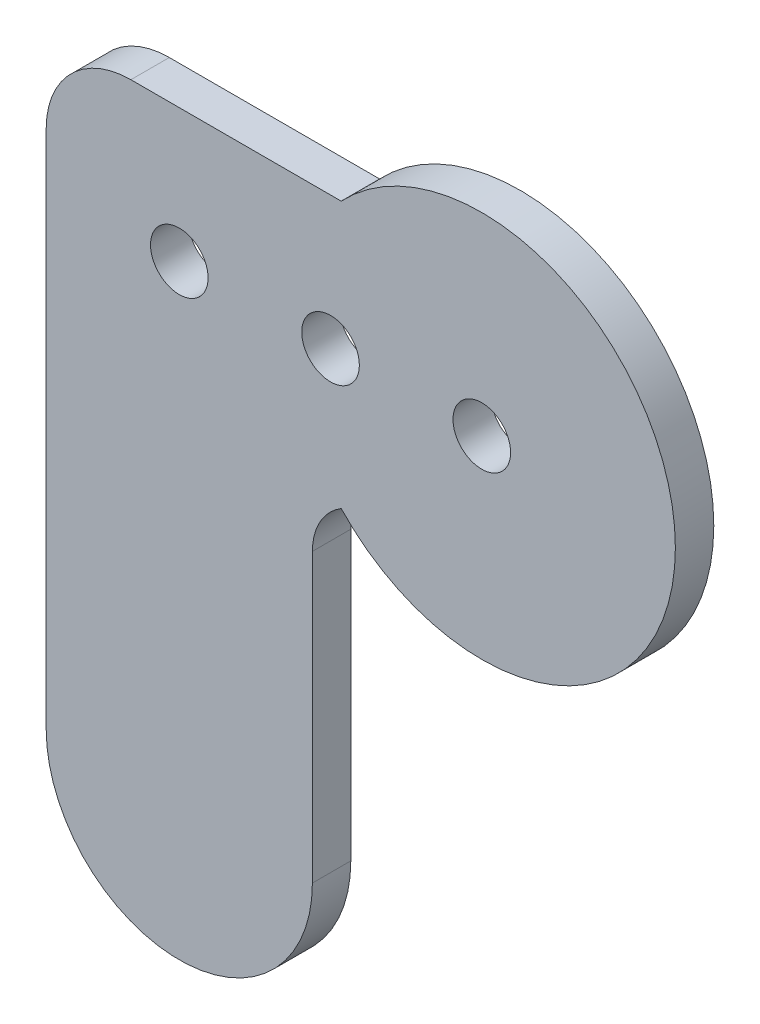
ISO-10303-21;
HEADER;
FILE_DESCRIPTION(('STEP AP214'),'2;1');
FILE_NAME('part.step','',(''),(''),'','','');
FILE_SCHEMA(('AUTOMOTIVE_DESIGN { 1 0 10303 214 1 1 1 1 }'));
ENDSEC;
DATA;
#1=APPLICATION_CONTEXT('core data for automotive mechanical design processes');
#2=APPLICATION_PROTOCOL_DEFINITION('international standard','automotive_design',2000,#1);
#3=PRODUCT_CONTEXT('',#1,'mechanical');
#4=PRODUCT('Part','Part','',(#3));
#5=PRODUCT_RELATED_PRODUCT_CATEGORY('part','',(#4));
#6=PRODUCT_DEFINITION_FORMATION('','',#4);
#7=PRODUCT_DEFINITION_CONTEXT('part definition',#1,'design');
#8=PRODUCT_DEFINITION('design','',#6,#7);
#9=PRODUCT_DEFINITION_SHAPE('','',#8);
#10=(LENGTH_UNIT() NAMED_UNIT(*) SI_UNIT(.MILLI.,.METRE.));
#11=(NAMED_UNIT(*) PLANE_ANGLE_UNIT() SI_UNIT($,.RADIAN.));
#12=(NAMED_UNIT(*) SI_UNIT($,.STERADIAN.) SOLID_ANGLE_UNIT());
#13=UNCERTAINTY_MEASURE_WITH_UNIT(LENGTH_MEASURE(1.E-05),#10,'distance_accuracy_value','');
#14=(GEOMETRIC_REPRESENTATION_CONTEXT(3) GLOBAL_UNCERTAINTY_ASSIGNED_CONTEXT((#13)) GLOBAL_UNIT_ASSIGNED_CONTEXT((#10,
#11,#12)) REPRESENTATION_CONTEXT('',''));
#15=CARTESIAN_POINT('',(0.,0.,0.));
#16=DIRECTION('',(0.,0.,1.));
#17=DIRECTION('',(1.,0.,0.));
#18=AXIS2_PLACEMENT_3D('',#15,#16,#17);
#19=CARTESIAN_POINT('',(0.,0.,3.175));
#20=DIRECTION('',(0.,0.,-1.));
#21=DIRECTION('',(-1.,0.,0.));
#22=AXIS2_PLACEMENT_3D('',#19,#20,#21);
#23=CYLINDRICAL_SURFACE('',#22,16.);
#24=CARTESIAN_POINT('',(0.,0.,0.));
#25=DIRECTION('',(0.,0.,1.));
#26=DIRECTION('',(1.,0.,0.));
#27=AXIS2_PLACEMENT_3D('',#24,#25,#26);
#28=CIRCLE('',#27,16.);
#29=CARTESIAN_POINT('',(-11.6189500386223,-11.,0.));
#30=VERTEX_POINT('',#29);
#31=CARTESIAN_POINT('',(-11.6189500386223,11.,0.));
#32=VERTEX_POINT('',#31);
#33=EDGE_CURVE('E115',#30,#32,#28,.T.);
#34=ORIENTED_EDGE('',*,*,#33,.T.);
#35=DIRECTION('',(0.,0.,-1.));
#36=VECTOR('',#35,1.);
#37=CARTESIAN_POINT('',(-11.6189500386223,11.,3.175));
#38=LINE('',#37,#36);
#39=CARTESIAN_POINT('',(-11.6189500386223,11.,3.175));
#40=VERTEX_POINT('',#39);
#41=EDGE_CURVE('E98',#40,#32,#38,.T.);
#42=ORIENTED_EDGE('',*,*,#41,.F.);
#43=CARTESIAN_POINT('',(0.,0.,3.175));
#44=DIRECTION('',(0.,0.,1.));
#45=DIRECTION('',(1.,0.,0.));
#46=AXIS2_PLACEMENT_3D('',#43,#44,#45);
#47=CIRCLE('',#46,16.);
#48=CARTESIAN_POINT('',(-11.6189500386223,-11.,3.175));
#49=VERTEX_POINT('',#48);
#50=EDGE_CURVE('E105',#49,#40,#47,.T.);
#51=ORIENTED_EDGE('',*,*,#50,.F.);
#52=DIRECTION('',(0.,0.,-1.));
#53=VECTOR('',#52,1.);
#54=CARTESIAN_POINT('',(-11.6189500386223,-11.,3.175));
#55=LINE('',#54,#53);
#56=EDGE_CURVE('E155',#49,#30,#55,.T.);
#57=ORIENTED_EDGE('',*,*,#56,.T.);
#58=EDGE_LOOP('',(#34,#42,#51,#57));
#59=FACE_BOUND('',#58,.T.);
#60=ADVANCED_FACE('F34',(#59),#23,.T.);
#61=CARTESIAN_POINT('',(-11.6189500386223,11.,3.175));
#62=DIRECTION('',(0.,-1.,0.));
#63=DIRECTION('',(1.,0.,0.));
#64=AXIS2_PLACEMENT_3D('',#61,#62,#63);
#65=PLANE('',#64);
#66=DIRECTION('',(-1.,0.,0.));
#67=VECTOR('',#66,1.);
#68=CARTESIAN_POINT('',(-11.6189500386223,11.,0.));
#69=LINE('',#68,#67);
#70=CARTESIAN_POINT('',(-29.,11.,0.));
#71=VERTEX_POINT('',#70);
#72=EDGE_CURVE('E143',#32,#71,#69,.T.);
#73=ORIENTED_EDGE('',*,*,#72,.T.);
#74=DIRECTION('',(0.,0.,-1.));
#75=VECTOR('',#74,1.);
#76=CARTESIAN_POINT('',(-29.,11.,3.175));
#77=LINE('',#76,#75);
#78=CARTESIAN_POINT('',(-29.,11.,3.175));
#79=VERTEX_POINT('',#78);
#80=EDGE_CURVE('E101',#71,#79,#77,.F.);
#81=ORIENTED_EDGE('',*,*,#80,.T.);
#82=DIRECTION('',(-1.,0.,0.));
#83=VECTOR('',#82,1.);
#84=CARTESIAN_POINT('',(-11.6189500386223,11.,3.175));
#85=LINE('',#84,#83);
#86=EDGE_CURVE('E93',#40,#79,#85,.T.);
#87=ORIENTED_EDGE('',*,*,#86,.F.);
#88=ORIENTED_EDGE('',*,*,#41,.T.);
#89=EDGE_LOOP('',(#73,#81,#87,#88));
#90=FACE_BOUND('',#89,.T.);
#91=ADVANCED_FACE('F96',(#90),#65,.F.);
#92=CARTESIAN_POINT('',(-36.,11.,3.175));
#93=DIRECTION('',(1.,0.,0.));
#94=DIRECTION('',(0.,1.,0.));
#95=AXIS2_PLACEMENT_3D('',#92,#93,#94);
#96=PLANE('',#95);
#97=DIRECTION('',(0.,-1.,0.));
#98=VECTOR('',#97,1.);
#99=CARTESIAN_POINT('',(-36.,11.,3.175));
#100=LINE('',#99,#98);
#101=CARTESIAN_POINT('',(-36.,3.99999999999999,3.175));
#102=VERTEX_POINT('',#101);
#103=CARTESIAN_POINT('',(-36.,-39.,3.175));
#104=VERTEX_POINT('',#103);
#105=EDGE_CURVE('E104',#102,#104,#100,.T.);
#106=ORIENTED_EDGE('',*,*,#105,.F.);
#107=DIRECTION('',(0.,0.,-1.));
#108=VECTOR('',#107,1.);
#109=CARTESIAN_POINT('',(-36.,3.99999999999999,3.175));
#110=LINE('',#109,#108);
#111=CARTESIAN_POINT('',(-36.,3.99999999999999,0.));
#112=VERTEX_POINT('',#111);
#113=EDGE_CURVE('E116',#102,#112,#110,.T.);
#114=ORIENTED_EDGE('',*,*,#113,.T.);
#115=DIRECTION('',(0.,-1.,0.));
#116=VECTOR('',#115,1.);
#117=CARTESIAN_POINT('',(-36.,11.,0.));
#118=LINE('',#117,#116);
#119=CARTESIAN_POINT('',(-36.,-39.,0.));
#120=VERTEX_POINT('',#119);
#121=EDGE_CURVE('E145',#112,#120,#118,.T.);
#122=ORIENTED_EDGE('',*,*,#121,.T.);
#123=DIRECTION('',(0.,0.,-1.));
#124=VECTOR('',#123,1.);
#125=CARTESIAN_POINT('',(-36.,-39.,3.175));
#126=LINE('',#125,#124);
#127=EDGE_CURVE('E117',#104,#120,#126,.T.);
#128=ORIENTED_EDGE('',*,*,#127,.F.);
#129=EDGE_LOOP('',(#106,#114,#122,#128));
#130=FACE_BOUND('',#129,.T.);
#131=ADVANCED_FACE('F136',(#130),#96,.F.);
#132=CARTESIAN_POINT('',(-25.,-39.,3.175));
#133=DIRECTION('',(0.,0.,-1.));
#134=DIRECTION('',(-1.,0.,0.));
#135=AXIS2_PLACEMENT_3D('',#132,#133,#134);
#136=CYLINDRICAL_SURFACE('',#135,11.);
#137=CARTESIAN_POINT('',(-25.,-39.,0.));
#138=DIRECTION('',(0.,0.,1.));
#139=DIRECTION('',(1.,0.,0.));
#140=AXIS2_PLACEMENT_3D('',#137,#138,#139);
#141=CIRCLE('',#140,11.);
#142=CARTESIAN_POINT('',(-14.,-39.,0.));
#143=VERTEX_POINT('',#142);
#144=EDGE_CURVE('E147',#120,#143,#141,.T.);
#145=ORIENTED_EDGE('',*,*,#144,.T.);
#146=DIRECTION('',(0.,0.,-1.));
#147=VECTOR('',#146,1.);
#148=CARTESIAN_POINT('',(-14.,-39.,3.175));
#149=LINE('',#148,#147);
#150=CARTESIAN_POINT('',(-14.,-39.,3.175));
#151=VERTEX_POINT('',#150);
#152=EDGE_CURVE('E123',#151,#143,#149,.T.);
#153=ORIENTED_EDGE('',*,*,#152,.F.);
#154=CARTESIAN_POINT('',(-25.,-39.,3.175));
#155=DIRECTION('',(0.,0.,1.));
#156=DIRECTION('',(1.,0.,0.));
#157=AXIS2_PLACEMENT_3D('',#154,#155,#156);
#158=CIRCLE('',#157,11.);
#159=EDGE_CURVE('E139',#104,#151,#158,.T.);
#160=ORIENTED_EDGE('',*,*,#159,.F.);
#161=ORIENTED_EDGE('',*,*,#127,.T.);
#162=EDGE_LOOP('',(#145,#153,#160,#161));
#163=FACE_BOUND('',#162,.T.);
#164=ADVANCED_FACE('F161',(#163),#136,.T.);
#165=CARTESIAN_POINT('',(-14.,-39.,3.175));
#166=DIRECTION('',(-1.,0.,0.));
#167=DIRECTION('',(0.,-1.,0.));
#168=AXIS2_PLACEMENT_3D('',#165,#166,#167);
#169=PLANE('',#168);
#170=DIRECTION('',(0.,1.,0.));
#171=VECTOR('',#170,1.);
#172=CARTESIAN_POINT('',(-14.,-39.,0.));
#173=LINE('',#172,#171);
#174=CARTESIAN_POINT('',(-14.,-15.2592371024868,0.));
#175=VERTEX_POINT('',#174);
#176=EDGE_CURVE('E113',#143,#175,#173,.T.);
#177=ORIENTED_EDGE('',*,*,#176,.T.);
#178=DIRECTION('',(0.,0.,-1.));
#179=VECTOR('',#178,1.);
#180=CARTESIAN_POINT('',(-14.,-15.2592371024868,3.175));
#181=LINE('',#180,#179);
#182=CARTESIAN_POINT('',(-14.,-15.2592371024868,3.175));
#183=VERTEX_POINT('',#182);
#184=EDGE_CURVE('E49',#175,#183,#181,.F.);
#185=ORIENTED_EDGE('',*,*,#184,.T.);
#186=DIRECTION('',(0.,1.,0.));
#187=VECTOR('',#186,1.);
#188=CARTESIAN_POINT('',(-14.,-39.,3.175));
#189=LINE('',#188,#187);
#190=EDGE_CURVE('E156',#151,#183,#189,.T.);
#191=ORIENTED_EDGE('',*,*,#190,.F.);
#192=ORIENTED_EDGE('',*,*,#152,.T.);
#193=EDGE_LOOP('',(#177,#185,#191,#192));
#194=FACE_BOUND('',#193,.T.);
#195=ADVANCED_FACE('F159',(#194),#169,.F.);
#196=CARTESIAN_POINT('',(0.,0.,3.175));
#197=DIRECTION('',(0.,0.,1.));
#198=DIRECTION('',(1.,0.,0.));
#199=AXIS2_PLACEMENT_3D('',#196,#197,#198);
#200=PLANE('',#199);
#201=CARTESIAN_POINT('',(-12.5,0.,3.175));
#202=DIRECTION('',(0.,0.,1.));
#203=DIRECTION('',(1.,0.,0.));
#204=AXIS2_PLACEMENT_3D('',#201,#202,#203);
#205=CIRCLE('',#204,2.38125);
#206=CARTESIAN_POINT('',(-10.11875,0.,3.175));
#207=VERTEX_POINT('',#206);
#208=EDGE_CURVE('E176',#207,#207,#205,.T.);
#209=ORIENTED_EDGE('',*,*,#208,.F.);
#210=EDGE_LOOP('',(#209));
#211=FACE_BOUND('',#210,.T.);
#212=CARTESIAN_POINT('',(-25.,0.,3.175));
#213=DIRECTION('',(0.,0.,1.));
#214=DIRECTION('',(1.,0.,0.));
#215=AXIS2_PLACEMENT_3D('',#212,#213,#214);
#216=CIRCLE('',#215,2.38125);
#217=CARTESIAN_POINT('',(-22.61875,0.,3.175));
#218=VERTEX_POINT('',#217);
#219=EDGE_CURVE('E170',#218,#218,#216,.T.);
#220=ORIENTED_EDGE('',*,*,#219,.F.);
#221=EDGE_LOOP('',(#220));
#222=FACE_BOUND('',#221,.T.);
#223=CARTESIAN_POINT('',(0.,0.,3.175));
#224=DIRECTION('',(0.,0.,1.));
#225=DIRECTION('',(1.,0.,0.));
#226=AXIS2_PLACEMENT_3D('',#223,#224,#225);
#227=CIRCLE('',#226,2.38125);
#228=CARTESIAN_POINT('',(2.38125,0.,3.175));
#229=VERTEX_POINT('',#228);
#230=EDGE_CURVE('E164',#229,#229,#227,.T.);
#231=ORIENTED_EDGE('',*,*,#230,.F.);
#232=EDGE_LOOP('',(#231));
#233=FACE_BOUND('',#232,.T.);
#234=ORIENTED_EDGE('',*,*,#86,.T.);
#235=CARTESIAN_POINT('',(-29.,3.99999999999999,3.175));
#236=DIRECTION('',(0.,0.,1.));
#237=DIRECTION('',(1.,0.,0.));
#238=AXIS2_PLACEMENT_3D('',#235,#236,#237);
#239=CIRCLE('',#238,7.);
#240=EDGE_CURVE('E129',#79,#102,#239,.T.);
#241=ORIENTED_EDGE('',*,*,#240,.T.);
#242=ORIENTED_EDGE('',*,*,#105,.T.);
#243=ORIENTED_EDGE('',*,*,#159,.T.);
#244=ORIENTED_EDGE('',*,*,#190,.T.);
#245=CARTESIAN_POINT('',(-9.00000000000001,-15.2592371024868,3.175));
#246=DIRECTION('',(0.,0.,1.));
#247=DIRECTION('',(1.,0.,0.));
#248=AXIS2_PLACEMENT_3D('',#245,#246,#247);
#249=CIRCLE('',#248,5.);
#250=EDGE_CURVE('E11',#183,#49,#249,.F.);
#251=ORIENTED_EDGE('',*,*,#250,.T.);
#252=ORIENTED_EDGE('',*,*,#50,.T.);
#253=EDGE_LOOP('',(#234,#241,#242,#243,#244,#251,#252));
#254=FACE_BOUND('',#253,.T.);
#255=ADVANCED_FACE('F108',(#211,#222,#233,#254),#200,.T.);
#256=CARTESIAN_POINT('',(0.,0.,0.));
#257=DIRECTION('',(0.,0.,1.));
#258=DIRECTION('',(1.,0.,0.));
#259=AXIS2_PLACEMENT_3D('',#256,#257,#258);
#260=PLANE('',#259);
#261=CARTESIAN_POINT('',(-12.5,0.,0.));
#262=DIRECTION('',(0.,0.,1.));
#263=DIRECTION('',(1.,0.,0.));
#264=AXIS2_PLACEMENT_3D('',#261,#262,#263);
#265=CIRCLE('',#264,2.38125);
#266=CARTESIAN_POINT('',(-10.11875,0.,0.));
#267=VERTEX_POINT('',#266);
#268=EDGE_CURVE('E167',#267,#267,#265,.T.);
#269=ORIENTED_EDGE('',*,*,#268,.T.);
#270=EDGE_LOOP('',(#269));
#271=FACE_BOUND('',#270,.T.);
#272=CARTESIAN_POINT('',(-25.,0.,0.));
#273=DIRECTION('',(0.,0.,1.));
#274=DIRECTION('',(1.,0.,0.));
#275=AXIS2_PLACEMENT_3D('',#272,#273,#274);
#276=CIRCLE('',#275,2.38125);
#277=CARTESIAN_POINT('',(-22.61875,0.,0.));
#278=VERTEX_POINT('',#277);
#279=EDGE_CURVE('E173',#278,#278,#276,.T.);
#280=ORIENTED_EDGE('',*,*,#279,.T.);
#281=EDGE_LOOP('',(#280));
#282=FACE_BOUND('',#281,.T.);
#283=CARTESIAN_POINT('',(0.,0.,0.));
#284=DIRECTION('',(0.,0.,1.));
#285=DIRECTION('',(1.,0.,0.));
#286=AXIS2_PLACEMENT_3D('',#283,#284,#285);
#287=CIRCLE('',#286,2.38125);
#288=CARTESIAN_POINT('',(2.38125,0.,0.));
#289=VERTEX_POINT('',#288);
#290=EDGE_CURVE('E149',#289,#289,#287,.T.);
#291=ORIENTED_EDGE('',*,*,#290,.T.);
#292=EDGE_LOOP('',(#291));
#293=FACE_BOUND('',#292,.T.);
#294=ORIENTED_EDGE('',*,*,#121,.F.);
#295=CARTESIAN_POINT('',(-29.,3.99999999999999,0.));
#296=DIRECTION('',(0.,0.,1.));
#297=DIRECTION('',(1.,0.,0.));
#298=AXIS2_PLACEMENT_3D('',#295,#296,#297);
#299=CIRCLE('',#298,7.);
#300=EDGE_CURVE('E120',#112,#71,#299,.F.);
#301=ORIENTED_EDGE('',*,*,#300,.T.);
#302=ORIENTED_EDGE('',*,*,#72,.F.);
#303=ORIENTED_EDGE('',*,*,#33,.F.);
#304=CARTESIAN_POINT('',(-9.00000000000001,-15.2592371024868,0.));
#305=DIRECTION('',(0.,0.,1.));
#306=DIRECTION('',(1.,0.,0.));
#307=AXIS2_PLACEMENT_3D('',#304,#305,#306);
#308=CIRCLE('',#307,5.);
#309=EDGE_CURVE('E42',#30,#175,#308,.T.);
#310=ORIENTED_EDGE('',*,*,#309,.T.);
#311=ORIENTED_EDGE('',*,*,#176,.F.);
#312=ORIENTED_EDGE('',*,*,#144,.F.);
#313=EDGE_LOOP('',(#294,#301,#302,#303,#310,#311,#312));
#314=FACE_BOUND('',#313,.T.);
#315=ADVANCED_FACE('F142',(#271,#282,#293,#314),#260,.F.);
#316=CARTESIAN_POINT('',(-29.,3.99999999999999,3.175));
#317=DIRECTION('',(0.,0.,-1.));
#318=DIRECTION('',(-1.,0.,0.));
#319=AXIS2_PLACEMENT_3D('',#316,#317,#318);
#320=CYLINDRICAL_SURFACE('',#319,7.);
#321=ORIENTED_EDGE('',*,*,#240,.F.);
#322=ORIENTED_EDGE('',*,*,#80,.F.);
#323=ORIENTED_EDGE('',*,*,#300,.F.);
#324=ORIENTED_EDGE('',*,*,#113,.F.);
#325=EDGE_LOOP('',(#321,#322,#323,#324));
#326=FACE_BOUND('',#325,.T.);
#327=ADVANCED_FACE('F141',(#326),#320,.T.);
#328=CARTESIAN_POINT('',(-9.00000000000001,-15.2592371024868,3.175));
#329=DIRECTION('',(0.,0.,-1.));
#330=DIRECTION('',(-1.,0.,0.));
#331=AXIS2_PLACEMENT_3D('',#328,#329,#330);
#332=CYLINDRICAL_SURFACE('',#331,5.);
#333=ORIENTED_EDGE('',*,*,#250,.F.);
#334=ORIENTED_EDGE('',*,*,#184,.F.);
#335=ORIENTED_EDGE('',*,*,#309,.F.);
#336=ORIENTED_EDGE('',*,*,#56,.F.);
#337=EDGE_LOOP('',(#333,#334,#335,#336));
#338=FACE_BOUND('',#337,.T.);
#339=ADVANCED_FACE('F36',(#338),#332,.F.);
#340=CARTESIAN_POINT('',(0.,0.,0.));
#341=DIRECTION('',(0.,0.,1.));
#342=DIRECTION('',(1.,0.,0.));
#343=AXIS2_PLACEMENT_3D('',#340,#341,#342);
#344=CYLINDRICAL_SURFACE('',#343,2.38125);
#345=ORIENTED_EDGE('',*,*,#290,.F.);
#346=EDGE_LOOP('',(#345));
#347=FACE_BOUND('',#346,.T.);
#348=ORIENTED_EDGE('',*,*,#230,.T.);
#349=EDGE_LOOP('',(#348));
#350=FACE_BOUND('',#349,.T.);
#351=ADVANCED_FACE('F198',(#347,#350),#344,.F.);
#352=CARTESIAN_POINT('',(-25.,0.,0.));
#353=DIRECTION('',(0.,0.,1.));
#354=DIRECTION('',(1.,0.,0.));
#355=AXIS2_PLACEMENT_3D('',#352,#353,#354);
#356=CYLINDRICAL_SURFACE('',#355,2.38125);
#357=ORIENTED_EDGE('',*,*,#279,.F.);
#358=EDGE_LOOP('',(#357));
#359=FACE_BOUND('',#358,.T.);
#360=ORIENTED_EDGE('',*,*,#219,.T.);
#361=EDGE_LOOP('',(#360));
#362=FACE_BOUND('',#361,.T.);
#363=ADVANCED_FACE('F187',(#359,#362),#356,.F.);
#364=CARTESIAN_POINT('',(-12.5,0.,0.));
#365=DIRECTION('',(0.,0.,1.));
#366=DIRECTION('',(1.,0.,0.));
#367=AXIS2_PLACEMENT_3D('',#364,#365,#366);
#368=CYLINDRICAL_SURFACE('',#367,2.38125);
#369=ORIENTED_EDGE('',*,*,#268,.F.);
#370=EDGE_LOOP('',(#369));
#371=FACE_BOUND('',#370,.T.);
#372=ORIENTED_EDGE('',*,*,#208,.T.);
#373=EDGE_LOOP('',(#372));
#374=FACE_BOUND('',#373,.T.);
#375=ADVANCED_FACE('F184',(#371,#374),#368,.F.);
#376=CLOSED_SHELL('',(#60,#91,#131,#164,#195,#255,#315,#327,#339,#351,#363,#375));
#377=MANIFOLD_SOLID_BREP('B2',#376);
#378=ADVANCED_BREP_SHAPE_REPRESENTATION('',(#18,#377),#14);
#379=SHAPE_DEFINITION_REPRESENTATION(#9,#378);
ENDSEC;
END-ISO-10303-21;
